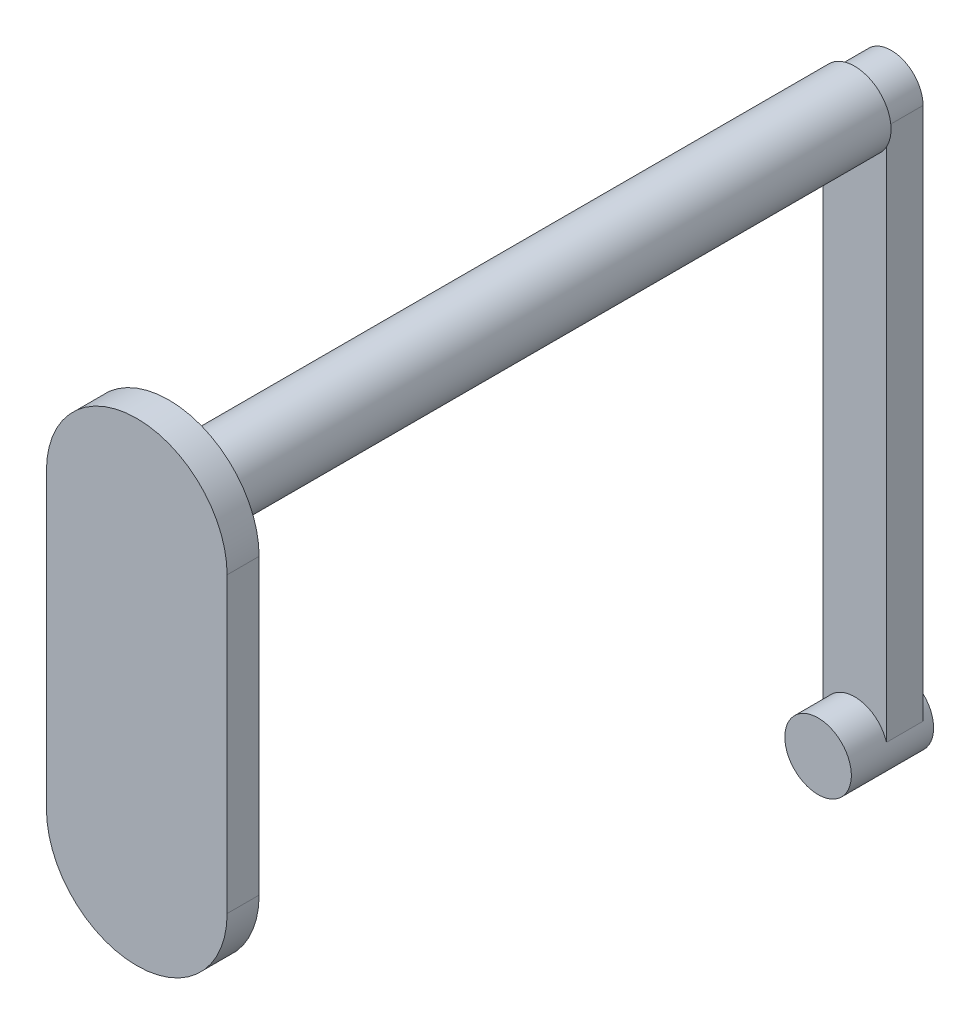
ISO-10303-21;
HEADER;
FILE_DESCRIPTION(('STEP AP214'),'2;1');
FILE_NAME('part.step','',(''),(''),'','','');
FILE_SCHEMA(('AUTOMOTIVE_DESIGN { 1 0 10303 214 1 1 1 1 }'));
ENDSEC;
DATA;
#1=APPLICATION_CONTEXT('core data for automotive mechanical design processes');
#2=APPLICATION_PROTOCOL_DEFINITION('international standard','automotive_design',2000,#1);
#3=PRODUCT_CONTEXT('',#1,'mechanical');
#4=PRODUCT('Part','Part','',(#3));
#5=PRODUCT_RELATED_PRODUCT_CATEGORY('part','',(#4));
#6=PRODUCT_DEFINITION_FORMATION('','',#4);
#7=PRODUCT_DEFINITION_CONTEXT('part definition',#1,'design');
#8=PRODUCT_DEFINITION('design','',#6,#7);
#9=PRODUCT_DEFINITION_SHAPE('','',#8);
#10=(LENGTH_UNIT() NAMED_UNIT(*) SI_UNIT(.MILLI.,.METRE.));
#11=(NAMED_UNIT(*) PLANE_ANGLE_UNIT() SI_UNIT($,.RADIAN.));
#12=(NAMED_UNIT(*) SI_UNIT($,.STERADIAN.) SOLID_ANGLE_UNIT());
#13=UNCERTAINTY_MEASURE_WITH_UNIT(LENGTH_MEASURE(1.E-05),#10,'distance_accuracy_value','');
#14=(GEOMETRIC_REPRESENTATION_CONTEXT(3) GLOBAL_UNCERTAINTY_ASSIGNED_CONTEXT((#13)) GLOBAL_UNIT_ASSIGNED_CONTEXT((#10,
#11,#12)) REPRESENTATION_CONTEXT('',''));
#15=CARTESIAN_POINT('',(0.,0.,0.));
#16=DIRECTION('',(0.,0.,1.));
#17=DIRECTION('',(1.,0.,0.));
#18=AXIS2_PLACEMENT_3D('',#15,#16,#17);
#19=CARTESIAN_POINT('',(0.,54.586532616395,-7.));
#20=DIRECTION('',(0.,0.,1.));
#21=DIRECTION('',(1.,0.,0.));
#22=AXIS2_PLACEMENT_3D('',#19,#20,#21);
#23=CYLINDRICAL_SURFACE('',#22,19.7577974806524);
#24=CARTESIAN_POINT('',(0.,54.586532616395,0.));
#25=DIRECTION('',(0.,0.,1.));
#26=DIRECTION('',(1.,0.,0.));
#27=AXIS2_PLACEMENT_3D('',#24,#25,#26);
#28=CIRCLE('',#27,19.7577974806524);
#29=CARTESIAN_POINT('',(-19.7577974806524,54.586532616395,0.));
#30=VERTEX_POINT('',#29);
#31=CARTESIAN_POINT('',(19.7577974806524,54.586532616395,0.));
#32=VERTEX_POINT('',#31);
#33=EDGE_CURVE('E156',#30,#32,#28,.T.);
#34=ORIENTED_EDGE('',*,*,#33,.F.);
#35=DIRECTION('',(0.,0.,1.));
#36=VECTOR('',#35,1.);
#37=CARTESIAN_POINT('',(-19.7577974806524,54.586532616395,-7.));
#38=LINE('',#37,#36);
#39=CARTESIAN_POINT('',(-19.7577974806524,54.586532616395,-7.));
#40=VERTEX_POINT('',#39);
#41=EDGE_CURVE('E181',#40,#30,#38,.T.);
#42=ORIENTED_EDGE('',*,*,#41,.F.);
#43=CARTESIAN_POINT('',(0.,54.586532616395,-7.));
#44=DIRECTION('',(0.,0.,1.));
#45=DIRECTION('',(1.,0.,0.));
#46=AXIS2_PLACEMENT_3D('',#43,#44,#45);
#47=CIRCLE('',#46,19.7577974806524);
#48=CARTESIAN_POINT('',(19.7577974806524,54.586532616395,-7.));
#49=VERTEX_POINT('',#48);
#50=EDGE_CURVE('E157',#40,#49,#47,.T.);
#51=ORIENTED_EDGE('',*,*,#50,.T.);
#52=DIRECTION('',(0.,0.,1.));
#53=VECTOR('',#52,1.);
#54=CARTESIAN_POINT('',(19.7577974806524,54.586532616395,-7.));
#55=LINE('',#54,#53);
#56=EDGE_CURVE('E170',#49,#32,#55,.T.);
#57=ORIENTED_EDGE('',*,*,#56,.T.);
#58=EDGE_LOOP('',(#34,#42,#51,#57));
#59=FACE_BOUND('',#58,.T.);
#60=ADVANCED_FACE('F41',(#59),#23,.T.);
#61=CARTESIAN_POINT('',(-19.7577974806524,54.586532616395,-7.));
#62=DIRECTION('',(-1.,0.,0.));
#63=DIRECTION('',(0.,0.,1.));
#64=AXIS2_PLACEMENT_3D('',#61,#62,#63);
#65=PLANE('',#64);
#66=DIRECTION('',(0.,-1.,0.));
#67=VECTOR('',#66,1.);
#68=CARTESIAN_POINT('',(-19.7577974806524,54.586532616395,0.));
#69=LINE('',#68,#67);
#70=CARTESIAN_POINT('',(-19.7577974806524,118.743389499605,0.));
#71=VERTEX_POINT('',#70);
#72=EDGE_CURVE('E161',#71,#30,#69,.T.);
#73=ORIENTED_EDGE('',*,*,#72,.F.);
#74=DIRECTION('',(0.,0.,1.));
#75=VECTOR('',#74,1.);
#76=CARTESIAN_POINT('',(-19.7577974806524,118.743389499605,-7.));
#77=LINE('',#76,#75);
#78=CARTESIAN_POINT('',(-19.7577974806524,118.743389499605,-7.));
#79=VERTEX_POINT('',#78);
#80=EDGE_CURVE('E184',#79,#71,#77,.T.);
#81=ORIENTED_EDGE('',*,*,#80,.F.);
#82=DIRECTION('',(0.,-1.,0.));
#83=VECTOR('',#82,1.);
#84=CARTESIAN_POINT('',(-19.7577974806524,54.586532616395,-7.));
#85=LINE('',#84,#83);
#86=EDGE_CURVE('E167',#79,#40,#85,.T.);
#87=ORIENTED_EDGE('',*,*,#86,.T.);
#88=ORIENTED_EDGE('',*,*,#41,.T.);
#89=EDGE_LOOP('',(#73,#81,#87,#88));
#90=FACE_BOUND('',#89,.T.);
#91=ADVANCED_FACE('F218',(#90),#65,.T.);
#92=CARTESIAN_POINT('',(0.,118.743389499605,-7.));
#93=DIRECTION('',(0.,0.,1.));
#94=DIRECTION('',(1.,0.,0.));
#95=AXIS2_PLACEMENT_3D('',#92,#93,#94);
#96=CYLINDRICAL_SURFACE('',#95,19.7577974806524);
#97=CARTESIAN_POINT('',(0.,118.743389499605,0.));
#98=DIRECTION('',(0.,0.,1.));
#99=DIRECTION('',(1.,0.,0.));
#100=AXIS2_PLACEMENT_3D('',#97,#98,#99);
#101=CIRCLE('',#100,19.7577974806524);
#102=CARTESIAN_POINT('',(19.7577974806524,118.743389499605,0.));
#103=VERTEX_POINT('',#102);
#104=EDGE_CURVE('E176',#103,#71,#101,.T.);
#105=ORIENTED_EDGE('',*,*,#104,.F.);
#106=DIRECTION('',(0.,0.,1.));
#107=VECTOR('',#106,1.);
#108=CARTESIAN_POINT('',(19.7577974806524,118.743389499605,-7.));
#109=LINE('',#108,#107);
#110=CARTESIAN_POINT('',(19.7577974806524,118.743389499605,-7.));
#111=VERTEX_POINT('',#110);
#112=EDGE_CURVE('E186',#111,#103,#109,.T.);
#113=ORIENTED_EDGE('',*,*,#112,.F.);
#114=CARTESIAN_POINT('',(0.,118.743389499605,-7.));
#115=DIRECTION('',(0.,0.,1.));
#116=DIRECTION('',(1.,0.,0.));
#117=AXIS2_PLACEMENT_3D('',#114,#115,#116);
#118=CIRCLE('',#117,19.7577974806524);
#119=EDGE_CURVE('E164',#111,#79,#118,.T.);
#120=ORIENTED_EDGE('',*,*,#119,.T.);
#121=ORIENTED_EDGE('',*,*,#80,.T.);
#122=EDGE_LOOP('',(#105,#113,#120,#121));
#123=FACE_BOUND('',#122,.T.);
#124=ADVANCED_FACE('F223',(#123),#96,.T.);
#125=CARTESIAN_POINT('',(19.7577974806524,54.586532616395,-7.));
#126=DIRECTION('',(1.,0.,0.));
#127=DIRECTION('',(0.,0.,-1.));
#128=AXIS2_PLACEMENT_3D('',#125,#126,#127);
#129=PLANE('',#128);
#130=DIRECTION('',(0.,1.,0.));
#131=VECTOR('',#130,1.);
#132=CARTESIAN_POINT('',(19.7577974806524,54.586532616395,0.));
#133=LINE('',#132,#131);
#134=EDGE_CURVE('E173',#32,#103,#133,.T.);
#135=ORIENTED_EDGE('',*,*,#134,.F.);
#136=ORIENTED_EDGE('',*,*,#56,.F.);
#137=DIRECTION('',(0.,1.,0.));
#138=VECTOR('',#137,1.);
#139=CARTESIAN_POINT('',(19.7577974806524,54.586532616395,-7.));
#140=LINE('',#139,#138);
#141=EDGE_CURVE('E160',#49,#111,#140,.T.);
#142=ORIENTED_EDGE('',*,*,#141,.T.);
#143=ORIENTED_EDGE('',*,*,#112,.T.);
#144=EDGE_LOOP('',(#135,#136,#142,#143));
#145=FACE_BOUND('',#144,.T.);
#146=ADVANCED_FACE('F236',(#145),#129,.T.);
#147=CARTESIAN_POINT('',(0.,54.586532616395,-7.));
#148=DIRECTION('',(0.,0.,1.));
#149=DIRECTION('',(1.,0.,0.));
#150=AXIS2_PLACEMENT_3D('',#147,#148,#149);
#151=PLANE('',#150);
#152=CARTESIAN_POINT('',(0.,118.743389499605,-7.00000000000001));
#153=DIRECTION('',(0.,0.,1.));
#154=DIRECTION('',(1.,0.,0.));
#155=AXIS2_PLACEMENT_3D('',#152,#153,#154);
#156=CIRCLE('',#155,7.95103533452267);
#157=CARTESIAN_POINT('',(7.95103533452267,118.743389499605,-7.00000000000001));
#158=VERTEX_POINT('',#157);
#159=EDGE_CURVE('E183',#158,#158,#156,.F.);
#160=ORIENTED_EDGE('',*,*,#159,.F.);
#161=EDGE_LOOP('',(#160));
#162=FACE_BOUND('',#161,.T.);
#163=ORIENTED_EDGE('',*,*,#50,.F.);
#164=ORIENTED_EDGE('',*,*,#86,.F.);
#165=ORIENTED_EDGE('',*,*,#119,.F.);
#166=ORIENTED_EDGE('',*,*,#141,.F.);
#167=EDGE_LOOP('',(#163,#164,#165,#166));
#168=FACE_BOUND('',#167,.T.);
#169=ADVANCED_FACE('F213',(#162,#168),#151,.F.);
#170=CARTESIAN_POINT('',(0.,54.586532616395,0.));
#171=DIRECTION('',(0.,0.,1.));
#172=DIRECTION('',(1.,0.,0.));
#173=AXIS2_PLACEMENT_3D('',#170,#171,#172);
#174=PLANE('',#173);
#175=ORIENTED_EDGE('',*,*,#33,.T.);
#176=ORIENTED_EDGE('',*,*,#134,.T.);
#177=ORIENTED_EDGE('',*,*,#104,.T.);
#178=ORIENTED_EDGE('',*,*,#72,.T.);
#179=EDGE_LOOP('',(#175,#176,#177,#178));
#180=FACE_BOUND('',#179,.T.);
#181=ADVANCED_FACE('F205',(#180),#174,.T.);
#182=CARTESIAN_POINT('',(0.,118.743389499605,-157.));
#183=DIRECTION('',(0.,0.,1.));
#184=DIRECTION('',(1.,0.,0.));
#185=AXIS2_PLACEMENT_3D('',#182,#183,#184);
#186=CYLINDRICAL_SURFACE('',#185,7.95103533452267);
#187=CARTESIAN_POINT('',(0.,118.743389499605,-157.));
#188=DIRECTION('',(0.,0.,-1.));
#189=DIRECTION('',(-1.,0.,0.));
#190=AXIS2_PLACEMENT_3D('',#187,#188,#189);
#191=CIRCLE('',#190,7.95103533452267);
#192=CARTESIAN_POINT('',(6.95868377585915,114.896873803755,-157.));
#193=VERTEX_POINT('',#192);
#194=CARTESIAN_POINT('',(-6.95868377585915,114.896873803755,-157.));
#195=VERTEX_POINT('',#194);
#196=EDGE_CURVE('E153',#193,#195,#191,.T.);
#197=ORIENTED_EDGE('',*,*,#196,.F.);
#198=EDGE_CURVE('E152',#195,#193,#191,.T.);
#199=ORIENTED_EDGE('',*,*,#198,.F.);
#200=EDGE_LOOP('',(#197,#199));
#201=FACE_BOUND('',#200,.T.);
#202=ORIENTED_EDGE('',*,*,#159,.T.);
#203=EDGE_LOOP('',(#202));
#204=FACE_BOUND('',#203,.T.);
#205=ADVANCED_FACE('F203',(#201,#204),#186,.T.);
#206=CARTESIAN_POINT('',(0.,118.743389499605,-157.));
#207=DIRECTION('',(0.,0.,-1.));
#208=DIRECTION('',(-1.,0.,0.));
#209=AXIS2_PLACEMENT_3D('',#206,#207,#208);
#210=PLANE('',#209);
#211=DIRECTION('',(0.,1.,0.));
#212=VECTOR('',#211,1.);
#213=CARTESIAN_POINT('',(-6.95868377585915,118.743389499605,-157.));
#214=LINE('',#213,#212);
#215=CARTESIAN_POINT('',(-6.95868377585915,118.743389499605,-157.));
#216=VERTEX_POINT('',#215);
#217=EDGE_CURVE('E48',#195,#216,#214,.T.);
#218=ORIENTED_EDGE('',*,*,#217,.F.);
#219=ORIENTED_EDGE('',*,*,#198,.T.);
#220=DIRECTION('',(0.,-1.,0.));
#221=VECTOR('',#220,1.);
#222=CARTESIAN_POINT('',(6.95868377585915,118.743389499605,-157.));
#223=LINE('',#222,#221);
#224=CARTESIAN_POINT('',(6.95868377585915,118.743389499605,-157.));
#225=VERTEX_POINT('',#224);
#226=EDGE_CURVE('E145',#225,#193,#223,.T.);
#227=ORIENTED_EDGE('',*,*,#226,.F.);
#228=CARTESIAN_POINT('',(0.,118.743389499605,-157.));
#229=DIRECTION('',(0.,0.,-1.));
#230=DIRECTION('',(-1.,0.,0.));
#231=AXIS2_PLACEMENT_3D('',#228,#229,#230);
#232=CIRCLE('',#231,6.95868377585915);
#233=EDGE_CURVE('E138',#216,#225,#232,.T.);
#234=ORIENTED_EDGE('',*,*,#233,.F.);
#235=EDGE_LOOP('',(#218,#219,#227,#234));
#236=FACE_BOUND('',#235,.T.);
#237=ADVANCED_FACE('F200',(#236),#210,.T.);
#238=CARTESIAN_POINT('',(0.,118.743389499605,-157.));
#239=DIRECTION('',(0.,0.,-1.));
#240=DIRECTION('',(-1.,0.,0.));
#241=AXIS2_PLACEMENT_3D('',#238,#239,#240);
#242=PLANE('',#241);
#243=CARTESIAN_POINT('',(-6.95868377585916,2.10657128454658,-157.));
#244=VERTEX_POINT('',#243);
#245=EDGE_CURVE('E139',#244,#195,#214,.T.);
#246=ORIENTED_EDGE('',*,*,#245,.F.);
#247=CARTESIAN_POINT('',(1.90819582357449E-11,-2.17603712826531E-11,-157.));
#248=DIRECTION('',(0.,0.,-1.));
#249=DIRECTION('',(-1.,0.,0.));
#250=AXIS2_PLACEMENT_3D('',#247,#248,#249);
#251=CIRCLE('',#250,7.27055173075875);
#252=CARTESIAN_POINT('',(6.95868377585913,2.10657128467275,-157.));
#253=VERTEX_POINT('',#252);
#254=EDGE_CURVE('E55',#244,#253,#251,.T.);
#255=ORIENTED_EDGE('',*,*,#254,.T.);
#256=EDGE_CURVE('E126',#193,#253,#223,.T.);
#257=ORIENTED_EDGE('',*,*,#256,.F.);
#258=ORIENTED_EDGE('',*,*,#196,.T.);
#259=EDGE_LOOP('',(#246,#255,#257,#258));
#260=FACE_BOUND('',#259,.T.);
#261=ADVANCED_FACE('F202',(#260),#242,.F.);
#262=CARTESIAN_POINT('',(0.,118.743389499605,-165.));
#263=DIRECTION('',(0.,0.,1.));
#264=DIRECTION('',(1.,0.,0.));
#265=AXIS2_PLACEMENT_3D('',#262,#263,#264);
#266=CYLINDRICAL_SURFACE('',#265,6.95868377585915);
#267=ORIENTED_EDGE('',*,*,#233,.T.);
#268=DIRECTION('',(0.,0.,1.));
#269=VECTOR('',#268,1.);
#270=CARTESIAN_POINT('',(6.95868377585915,118.743389499605,-165.));
#271=LINE('',#270,#269);
#272=CARTESIAN_POINT('',(6.95868377585915,118.743389499605,-165.));
#273=VERTEX_POINT('',#272);
#274=EDGE_CURVE('E150',#273,#225,#271,.T.);
#275=ORIENTED_EDGE('',*,*,#274,.F.);
#276=CARTESIAN_POINT('',(0.,118.743389499605,-165.));
#277=DIRECTION('',(0.,0.,-1.));
#278=DIRECTION('',(-1.,0.,0.));
#279=AXIS2_PLACEMENT_3D('',#276,#277,#278);
#280=CIRCLE('',#279,6.95868377585915);
#281=CARTESIAN_POINT('',(-6.95868377585915,118.743389499605,-165.));
#282=VERTEX_POINT('',#281);
#283=EDGE_CURVE('E116',#282,#273,#280,.T.);
#284=ORIENTED_EDGE('',*,*,#283,.F.);
#285=DIRECTION('',(0.,0.,1.));
#286=VECTOR('',#285,1.);
#287=CARTESIAN_POINT('',(-6.95868377585915,118.743389499605,-165.));
#288=LINE('',#287,#286);
#289=EDGE_CURVE('E142',#282,#216,#288,.T.);
#290=ORIENTED_EDGE('',*,*,#289,.T.);
#291=EDGE_LOOP('',(#267,#275,#284,#290));
#292=FACE_BOUND('',#291,.T.);
#293=ADVANCED_FACE('F199',(#292),#266,.T.);
#294=CARTESIAN_POINT('',(6.95868377585915,118.743389499605,-165.));
#295=DIRECTION('',(-1.,0.,0.));
#296=DIRECTION('',(0.,-1.,0.));
#297=AXIS2_PLACEMENT_3D('',#294,#295,#296);
#298=PLANE('',#297);
#299=ORIENTED_EDGE('',*,*,#256,.T.);
#300=DIRECTION('',(0.,0.,-1.));
#301=VECTOR('',#300,1.);
#302=CARTESIAN_POINT('',(6.95868377585913,2.10657128467274,-149.));
#303=LINE('',#302,#301);
#304=CARTESIAN_POINT('',(6.95868377585913,2.10657128467274,-165.));
#305=VERTEX_POINT('',#304);
#306=EDGE_CURVE('E123',#253,#305,#303,.T.);
#307=ORIENTED_EDGE('',*,*,#306,.T.);
#308=DIRECTION('',(0.,-1.,0.));
#309=VECTOR('',#308,1.);
#310=CARTESIAN_POINT('',(6.95868377585915,118.743389499605,-165.));
#311=LINE('',#310,#309);
#312=EDGE_CURVE('E112',#273,#305,#311,.T.);
#313=ORIENTED_EDGE('',*,*,#312,.F.);
#314=ORIENTED_EDGE('',*,*,#274,.T.);
#315=ORIENTED_EDGE('',*,*,#226,.T.);
#316=EDGE_LOOP('',(#299,#307,#313,#314,#315));
#317=FACE_BOUND('',#316,.T.);
#318=ADVANCED_FACE('F124',(#317),#298,.F.);
#319=CARTESIAN_POINT('',(-6.95868377585915,118.743389499605,-165.));
#320=DIRECTION('',(1.,0.,0.));
#321=DIRECTION('',(0.,1.,0.));
#322=AXIS2_PLACEMENT_3D('',#319,#320,#321);
#323=PLANE('',#322);
#324=DIRECTION('',(0.,1.,0.));
#325=VECTOR('',#324,1.);
#326=CARTESIAN_POINT('',(-6.95868377585915,118.743389499605,-165.));
#327=LINE('',#326,#325);
#328=CARTESIAN_POINT('',(-6.95868377585916,2.10657128454658,-165.));
#329=VERTEX_POINT('',#328);
#330=EDGE_CURVE('E120',#329,#282,#327,.T.);
#331=ORIENTED_EDGE('',*,*,#330,.F.);
#332=DIRECTION('',(0.,0.,-1.));
#333=VECTOR('',#332,1.);
#334=CARTESIAN_POINT('',(-6.95868377585916,2.10657128454658,-149.));
#335=LINE('',#334,#333);
#336=EDGE_CURVE('E63',#329,#244,#335,.F.);
#337=ORIENTED_EDGE('',*,*,#336,.T.);
#338=ORIENTED_EDGE('',*,*,#245,.T.);
#339=ORIENTED_EDGE('',*,*,#217,.T.);
#340=ORIENTED_EDGE('',*,*,#289,.F.);
#341=EDGE_LOOP('',(#331,#337,#338,#339,#340));
#342=FACE_BOUND('',#341,.T.);
#343=ADVANCED_FACE('F194',(#342),#323,.F.);
#344=CARTESIAN_POINT('',(0.,118.743389499605,-165.));
#345=DIRECTION('',(0.,0.,-1.));
#346=DIRECTION('',(-1.,0.,0.));
#347=AXIS2_PLACEMENT_3D('',#344,#345,#346);
#348=PLANE('',#347);
#349=CARTESIAN_POINT('',(1.90819582357449E-11,-2.17603712826531E-11,-165.));
#350=DIRECTION('',(0.,0.,-1.));
#351=DIRECTION('',(-1.,0.,0.));
#352=AXIS2_PLACEMENT_3D('',#349,#350,#351);
#353=CIRCLE('',#352,7.27055173075875);
#354=EDGE_CURVE('E11',#329,#305,#353,.T.);
#355=ORIENTED_EDGE('',*,*,#354,.F.);
#356=ORIENTED_EDGE('',*,*,#330,.T.);
#357=ORIENTED_EDGE('',*,*,#283,.T.);
#358=ORIENTED_EDGE('',*,*,#312,.T.);
#359=EDGE_LOOP('',(#355,#356,#357,#358));
#360=FACE_BOUND('',#359,.T.);
#361=ADVANCED_FACE('F114',(#360),#348,.T.);
#362=CARTESIAN_POINT('',(1.90819582357449E-11,-2.17603712826531E-11,-149.));
#363=DIRECTION('',(0.,0.,-1.));
#364=DIRECTION('',(-1.,0.,0.));
#365=AXIS2_PLACEMENT_3D('',#362,#363,#364);
#366=CYLINDRICAL_SURFACE('',#365,7.27055173075875);
#367=CARTESIAN_POINT('',(1.90819582357449E-11,-2.17603712826531E-11,-167.));
#368=DIRECTION('',(0.,0.,-1.));
#369=DIRECTION('',(-1.,0.,0.));
#370=AXIS2_PLACEMENT_3D('',#367,#368,#369);
#371=CIRCLE('',#370,7.27055173075875);
#372=CARTESIAN_POINT('',(-7.27055173073967,-2.17603712826531E-11,-167.));
#373=VERTEX_POINT('',#372);
#374=EDGE_CURVE('E133',#373,#373,#371,.T.);
#375=ORIENTED_EDGE('',*,*,#374,.F.);
#376=EDGE_LOOP('',(#375));
#377=FACE_BOUND('',#376,.T.);
#378=CARTESIAN_POINT('',(1.90819582357449E-11,-2.17603712826531E-11,-149.));
#379=DIRECTION('',(0.,0.,-1.));
#380=DIRECTION('',(-1.,0.,0.));
#381=AXIS2_PLACEMENT_3D('',#378,#379,#380);
#382=CIRCLE('',#381,7.27055173075875);
#383=CARTESIAN_POINT('',(-7.27055173073967,-2.17603712826531E-11,-149.));
#384=VERTEX_POINT('',#383);
#385=EDGE_CURVE('E130',#384,#384,#382,.T.);
#386=ORIENTED_EDGE('',*,*,#385,.T.);
#387=EDGE_LOOP('',(#386));
#388=FACE_BOUND('',#387,.T.);
#389=ORIENTED_EDGE('',*,*,#254,.F.);
#390=ORIENTED_EDGE('',*,*,#336,.F.);
#391=ORIENTED_EDGE('',*,*,#354,.T.);
#392=ORIENTED_EDGE('',*,*,#306,.F.);
#393=EDGE_LOOP('',(#389,#390,#391,#392));
#394=FACE_BOUND('',#393,.T.);
#395=ADVANCED_FACE('F129',(#377,#388,#394),#366,.T.);
#396=CARTESIAN_POINT('',(1.90819582357449E-11,-2.17603712826531E-11,-149.));
#397=DIRECTION('',(0.,0.,-1.));
#398=DIRECTION('',(-1.,0.,0.));
#399=AXIS2_PLACEMENT_3D('',#396,#397,#398);
#400=PLANE('',#399);
#401=ORIENTED_EDGE('',*,*,#385,.F.);
#402=EDGE_LOOP('',(#401));
#403=FACE_BOUND('',#402,.T.);
#404=ADVANCED_FACE('F325',(#403),#400,.F.);
#405=CARTESIAN_POINT('',(1.90819582357449E-11,-2.17603712826531E-11,-167.));
#406=DIRECTION('',(0.,0.,-1.));
#407=DIRECTION('',(-1.,0.,0.));
#408=AXIS2_PLACEMENT_3D('',#405,#406,#407);
#409=PLANE('',#408);
#410=ORIENTED_EDGE('',*,*,#374,.T.);
#411=EDGE_LOOP('',(#410));
#412=FACE_BOUND('',#411,.T.);
#413=ADVANCED_FACE('F334',(#412),#409,.T.);
#414=CLOSED_SHELL('',(#60,#91,#124,#146,#169,#181,#205,#237,#261,#293,#318,#343,#361,#395,#404,#413));
#415=MANIFOLD_SOLID_BREP('B2',#414);
#416=ADVANCED_BREP_SHAPE_REPRESENTATION('',(#18,#415),#14);
#417=SHAPE_DEFINITION_REPRESENTATION(#9,#416);
ENDSEC;
END-ISO-10303-21;
